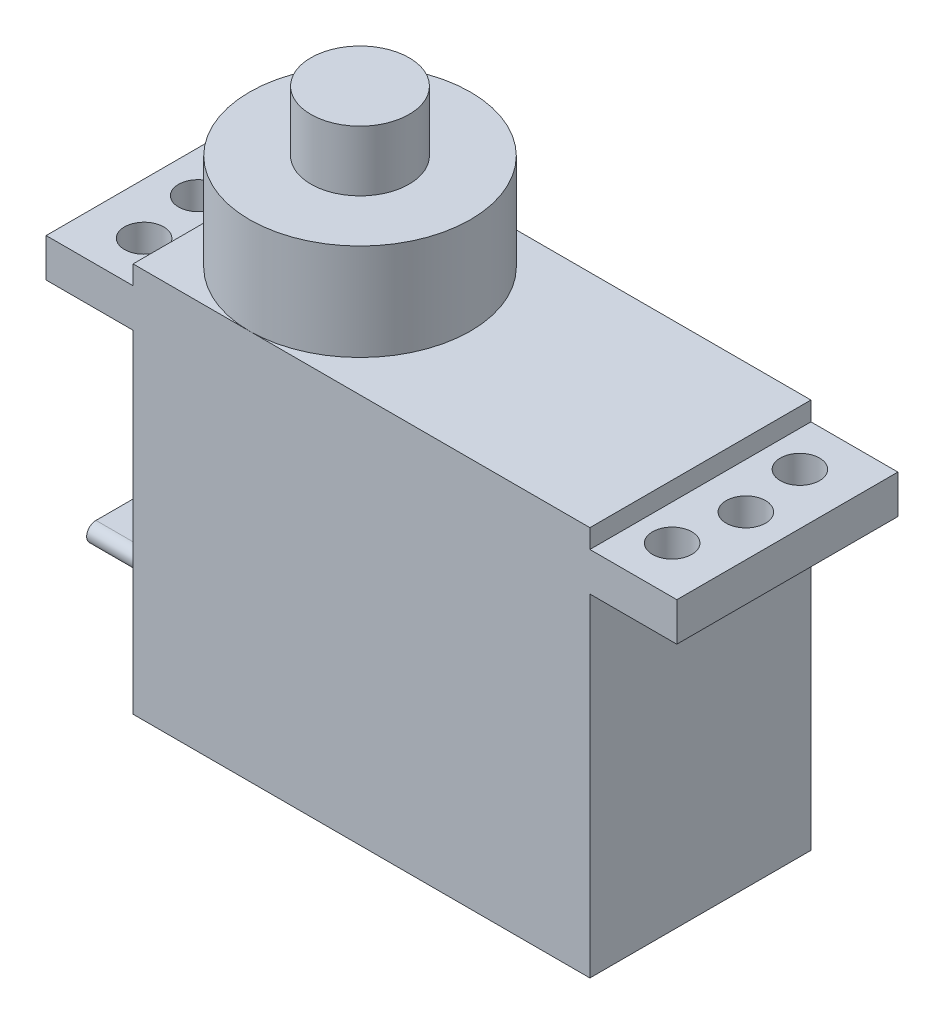
ISO-10303-21;
HEADER;
FILE_DESCRIPTION(('STEP AP214'),'2;1');
FILE_NAME('part.step','',(''),(''),'','','');
FILE_SCHEMA(('AUTOMOTIVE_DESIGN { 1 0 10303 214 1 1 1 1 }'));
ENDSEC;
DATA;
#1=APPLICATION_CONTEXT('core data for automotive mechanical design processes');
#2=APPLICATION_PROTOCOL_DEFINITION('international standard','automotive_design',2000,#1);
#3=PRODUCT_CONTEXT('',#1,'mechanical');
#4=PRODUCT('Part','Part','',(#3));
#5=PRODUCT_RELATED_PRODUCT_CATEGORY('part','',(#4));
#6=PRODUCT_DEFINITION_FORMATION('','',#4);
#7=PRODUCT_DEFINITION_CONTEXT('part definition',#1,'design');
#8=PRODUCT_DEFINITION('design','',#6,#7);
#9=PRODUCT_DEFINITION_SHAPE('','',#8);
#10=(LENGTH_UNIT() NAMED_UNIT(*) SI_UNIT(.MILLI.,.METRE.));
#11=(NAMED_UNIT(*) PLANE_ANGLE_UNIT() SI_UNIT($,.RADIAN.));
#12=(NAMED_UNIT(*) SI_UNIT($,.STERADIAN.) SOLID_ANGLE_UNIT());
#13=UNCERTAINTY_MEASURE_WITH_UNIT(LENGTH_MEASURE(1.E-05),#10,'distance_accuracy_value','');
#14=(GEOMETRIC_REPRESENTATION_CONTEXT(3) GLOBAL_UNCERTAINTY_ASSIGNED_CONTEXT((#13)) GLOBAL_UNIT_ASSIGNED_CONTEXT((#10,
#11,#12)) REPRESENTATION_CONTEXT('',''));
#15=CARTESIAN_POINT('',(0.,0.,0.));
#16=DIRECTION('',(0.,0.,1.));
#17=DIRECTION('',(1.,0.,0.));
#18=AXIS2_PLACEMENT_3D('',#15,#16,#17);
#19=CARTESIAN_POINT('',(-13.2207,0.,0.));
#20=DIRECTION('',(1.,0.,0.));
#21=DIRECTION('',(0.,0.,-1.));
#22=AXIS2_PLACEMENT_3D('',#19,#20,#21);
#23=PLANE('',#22);
#24=DIRECTION('',(0.,-1.,0.));
#25=VECTOR('',#24,1.);
#26=CARTESIAN_POINT('',(-13.2207,1.524,-3.0226));
#27=LINE('',#26,#25);
#28=CARTESIAN_POINT('',(-13.2207,4.826,-3.0226));
#29=VERTEX_POINT('',#28);
#30=CARTESIAN_POINT('',(-13.2207,1.524,-3.0226));
#31=VERTEX_POINT('',#30);
#32=EDGE_CURVE('E210',#29,#31,#27,.T.);
#33=ORIENTED_EDGE('',*,*,#32,.T.);
#34=DIRECTION('',(0.,0.,1.));
#35=VECTOR('',#34,1.);
#36=CARTESIAN_POINT('',(-13.2207,1.524,-3.0226));
#37=LINE('',#36,#35);
#38=CARTESIAN_POINT('',(-13.2207,1.524,3.0226));
#39=VERTEX_POINT('',#38);
#40=EDGE_CURVE('E213',#31,#39,#37,.T.);
#41=ORIENTED_EDGE('',*,*,#40,.T.);
#42=DIRECTION('',(0.,1.,0.));
#43=VECTOR('',#42,1.);
#44=CARTESIAN_POINT('',(-13.2207,1.524,3.0226));
#45=LINE('',#44,#43);
#46=CARTESIAN_POINT('',(-13.2207,4.826,3.0226));
#47=VERTEX_POINT('',#46);
#48=EDGE_CURVE('E216',#39,#47,#45,.T.);
#49=ORIENTED_EDGE('',*,*,#48,.T.);
#50=DIRECTION('',(0.,0.,-1.));
#51=VECTOR('',#50,1.);
#52=CARTESIAN_POINT('',(-13.2207,4.826,-3.0226));
#53=LINE('',#52,#51);
#54=EDGE_CURVE('E218',#47,#29,#53,.T.);
#55=ORIENTED_EDGE('',*,*,#54,.T.);
#56=EDGE_LOOP('',(#33,#41,#49,#55));
#57=FACE_BOUND('',#56,.T.);
#58=CARTESIAN_POINT('',(-13.2207,3.175,1.651));
#59=DIRECTION('',(-1.,0.,0.));
#60=DIRECTION('',(0.,0.,1.));
#61=AXIS2_PLACEMENT_3D('',#58,#59,#60);
#62=CIRCLE('',#61,0.4826);
#63=CARTESIAN_POINT('',(-13.2207,2.6924,1.651));
#64=VERTEX_POINT('',#63);
#65=CARTESIAN_POINT('',(-13.2207,3.6576,1.651));
#66=VERTEX_POINT('',#65);
#67=EDGE_CURVE('E53',#64,#66,#62,.T.);
#68=ORIENTED_EDGE('',*,*,#67,.F.);
#69=DIRECTION('',(0.,0.,1.));
#70=VECTOR('',#69,1.);
#71=CARTESIAN_POINT('',(-13.2207,2.6924,1.651));
#72=LINE('',#71,#70);
#73=CARTESIAN_POINT('',(-13.2207,2.6924,-1.651));
#74=VERTEX_POINT('',#73);
#75=EDGE_CURVE('E57',#74,#64,#72,.T.);
#76=ORIENTED_EDGE('',*,*,#75,.F.);
#77=CARTESIAN_POINT('',(-13.2207,3.175,-1.651));
#78=DIRECTION('',(-1.,0.,0.));
#79=DIRECTION('',(0.,0.,1.));
#80=AXIS2_PLACEMENT_3D('',#77,#78,#79);
#81=CIRCLE('',#80,0.4826);
#82=CARTESIAN_POINT('',(-13.2207,3.6576,-1.651));
#83=VERTEX_POINT('',#82);
#84=EDGE_CURVE('E727',#83,#74,#81,.T.);
#85=ORIENTED_EDGE('',*,*,#84,.F.);
#86=DIRECTION('',(0.,0.,-1.));
#87=VECTOR('',#86,1.);
#88=CARTESIAN_POINT('',(-13.2207,3.6576,1.651));
#89=LINE('',#88,#87);
#90=EDGE_CURVE('E733',#66,#83,#89,.T.);
#91=ORIENTED_EDGE('',*,*,#90,.F.);
#92=EDGE_LOOP('',(#68,#76,#85,#91));
#93=FACE_BOUND('',#92,.T.);
#94=ADVANCED_FACE('F36',(#57,#93),#23,.F.);
#95=CARTESIAN_POINT('',(-11.811,20.1676,5.715));
#96=DIRECTION('',(1.,0.,0.));
#97=DIRECTION('',(0.,1.,0.));
#98=AXIS2_PLACEMENT_3D('',#95,#96,#97);
#99=PLANE('',#98);
#100=DIRECTION('',(0.,0.,1.));
#101=VECTOR('',#100,1.);
#102=CARTESIAN_POINT('',(-11.811,17.1958,-5.715));
#103=LINE('',#102,#101);
#104=CARTESIAN_POINT('',(-11.811,17.1958,-5.715));
#105=VERTEX_POINT('',#104);
#106=CARTESIAN_POINT('',(-11.811,17.1958,5.715));
#107=VERTEX_POINT('',#106);
#108=EDGE_CURVE('E303',#105,#107,#103,.T.);
#109=ORIENTED_EDGE('',*,*,#108,.F.);
#110=DIRECTION('',(0.,-1.,0.));
#111=VECTOR('',#110,1.);
#112=CARTESIAN_POINT('',(-11.811,20.1676,-5.715));
#113=LINE('',#112,#111);
#114=CARTESIAN_POINT('',(-11.811,0.,-5.715));
#115=VERTEX_POINT('',#114);
#116=EDGE_CURVE('E353',#105,#115,#113,.T.);
#117=ORIENTED_EDGE('',*,*,#116,.T.);
#118=DIRECTION('',(0.,0.,-1.));
#119=VECTOR('',#118,1.);
#120=CARTESIAN_POINT('',(-11.811,0.,5.715));
#121=LINE('',#120,#119);
#122=CARTESIAN_POINT('',(-11.811,0.,5.715));
#123=VERTEX_POINT('',#122);
#124=EDGE_CURVE('E360',#123,#115,#121,.T.);
#125=ORIENTED_EDGE('',*,*,#124,.F.);
#126=DIRECTION('',(0.,-1.,0.));
#127=VECTOR('',#126,1.);
#128=CARTESIAN_POINT('',(-11.811,20.1676,5.715));
#129=LINE('',#128,#127);
#130=EDGE_CURVE('E339',#107,#123,#129,.T.);
#131=ORIENTED_EDGE('',*,*,#130,.F.);
#132=EDGE_LOOP('',(#109,#117,#125,#131));
#133=FACE_BOUND('',#132,.T.);
#134=DIRECTION('',(0.,-1.,0.));
#135=VECTOR('',#134,1.);
#136=CARTESIAN_POINT('',(-11.811,1.524,-3.0226));
#137=LINE('',#136,#135);
#138=CARTESIAN_POINT('',(-11.811,4.826,-3.0226));
#139=VERTEX_POINT('',#138);
#140=CARTESIAN_POINT('',(-11.811,1.524,-3.0226));
#141=VERTEX_POINT('',#140);
#142=EDGE_CURVE('E201',#139,#141,#137,.T.);
#143=ORIENTED_EDGE('',*,*,#142,.F.);
#144=DIRECTION('',(0.,0.,-1.));
#145=VECTOR('',#144,1.);
#146=CARTESIAN_POINT('',(-11.811,4.826,-3.0226));
#147=LINE('',#146,#145);
#148=CARTESIAN_POINT('',(-11.811,4.826,3.0226));
#149=VERTEX_POINT('',#148);
#150=EDGE_CURVE('E214',#149,#139,#147,.T.);
#151=ORIENTED_EDGE('',*,*,#150,.F.);
#152=DIRECTION('',(0.,1.,0.));
#153=VECTOR('',#152,1.);
#154=CARTESIAN_POINT('',(-11.811,1.524,3.0226));
#155=LINE('',#154,#153);
#156=CARTESIAN_POINT('',(-11.811,1.524,3.0226));
#157=VERTEX_POINT('',#156);
#158=EDGE_CURVE('E223',#157,#149,#155,.T.);
#159=ORIENTED_EDGE('',*,*,#158,.F.);
#160=DIRECTION('',(0.,0.,1.));
#161=VECTOR('',#160,1.);
#162=CARTESIAN_POINT('',(-11.811,1.524,-3.0226));
#163=LINE('',#162,#161);
#164=EDGE_CURVE('E204',#141,#157,#163,.T.);
#165=ORIENTED_EDGE('',*,*,#164,.F.);
#166=EDGE_LOOP('',(#143,#151,#159,#165));
#167=FACE_BOUND('',#166,.T.);
#168=ADVANCED_FACE('F431',(#133,#167),#99,.F.);
#169=CARTESIAN_POINT('',(-11.811,20.1676,5.715));
#170=DIRECTION('',(0.,-1.,0.));
#171=DIRECTION('',(1.,0.,0.));
#172=AXIS2_PLACEMENT_3D('',#169,#170,#171);
#173=PLANE('',#172);
#174=DIRECTION('',(-1.,0.,0.));
#175=VECTOR('',#174,1.);
#176=CARTESIAN_POINT('',(-11.811,20.1676,5.715));
#177=LINE('',#176,#175);
#178=CARTESIAN_POINT('',(-5.7912,20.1676,5.715));
#179=VERTEX_POINT('',#178);
#180=CARTESIAN_POINT('',(-11.811,20.1676,5.715));
#181=VERTEX_POINT('',#180);
#182=EDGE_CURVE('E334',#179,#181,#177,.T.);
#183=ORIENTED_EDGE('',*,*,#182,.F.);
#184=CARTESIAN_POINT('',(-5.7912,20.1676,0.));
#185=DIRECTION('',(0.,-1.,0.));
#186=DIRECTION('',(1.,0.,0.));
#187=AXIS2_PLACEMENT_3D('',#184,#185,#186);
#188=CIRCLE('',#187,5.715);
#189=CARTESIAN_POINT('',(-5.7912,20.1676,-5.715));
#190=VERTEX_POINT('',#189);
#191=EDGE_CURVE('E276',#179,#190,#188,.T.);
#192=ORIENTED_EDGE('',*,*,#191,.T.);
#193=DIRECTION('',(-1.,0.,0.));
#194=VECTOR('',#193,1.);
#195=CARTESIAN_POINT('',(-11.811,20.1676,-5.715));
#196=LINE('',#195,#194);
#197=CARTESIAN_POINT('',(-11.811,20.1676,-5.715));
#198=VERTEX_POINT('',#197);
#199=EDGE_CURVE('E349',#190,#198,#196,.T.);
#200=ORIENTED_EDGE('',*,*,#199,.T.);
#201=DIRECTION('',(0.,0.,-1.));
#202=VECTOR('',#201,1.);
#203=CARTESIAN_POINT('',(-11.811,20.1676,5.715));
#204=LINE('',#203,#202);
#205=EDGE_CURVE('E363',#181,#198,#204,.T.);
#206=ORIENTED_EDGE('',*,*,#205,.F.);
#207=EDGE_LOOP('',(#183,#192,#200,#206));
#208=FACE_BOUND('',#207,.T.);
#209=ADVANCED_FACE('F412',(#208),#173,.F.);
#210=CARTESIAN_POINT('',(11.811,20.1676,5.715));
#211=DIRECTION('',(-1.,0.,0.));
#212=DIRECTION('',(0.,-1.,0.));
#213=AXIS2_PLACEMENT_3D('',#210,#211,#212);
#214=PLANE('',#213);
#215=DIRECTION('',(0.,1.,0.));
#216=VECTOR('',#215,1.);
#217=CARTESIAN_POINT('',(11.811,20.1676,-5.715));
#218=LINE('',#217,#216);
#219=CARTESIAN_POINT('',(11.811,0.,-5.715));
#220=VERTEX_POINT('',#219);
#221=CARTESIAN_POINT('',(11.811,17.1958,-5.715));
#222=VERTEX_POINT('',#221);
#223=EDGE_CURVE('E346',#220,#222,#218,.T.);
#224=ORIENTED_EDGE('',*,*,#223,.T.);
#225=DIRECTION('',(0.,0.,1.));
#226=VECTOR('',#225,1.);
#227=CARTESIAN_POINT('',(11.811,17.1958,-5.715));
#228=LINE('',#227,#226);
#229=CARTESIAN_POINT('',(11.811,17.1958,5.715));
#230=VERTEX_POINT('',#229);
#231=EDGE_CURVE('E281',#222,#230,#228,.T.);
#232=ORIENTED_EDGE('',*,*,#231,.T.);
#233=DIRECTION('',(0.,1.,0.));
#234=VECTOR('',#233,1.);
#235=CARTESIAN_POINT('',(11.811,20.1676,5.715));
#236=LINE('',#235,#234);
#237=CARTESIAN_POINT('',(11.811,0.,5.715));
#238=VERTEX_POINT('',#237);
#239=EDGE_CURVE('E331',#238,#230,#236,.T.);
#240=ORIENTED_EDGE('',*,*,#239,.F.);
#241=DIRECTION('',(0.,0.,-1.));
#242=VECTOR('',#241,1.);
#243=CARTESIAN_POINT('',(11.811,0.,5.715));
#244=LINE('',#243,#242);
#245=EDGE_CURVE('E345',#238,#220,#244,.T.);
#246=ORIENTED_EDGE('',*,*,#245,.T.);
#247=EDGE_LOOP('',(#224,#232,#240,#246));
#248=FACE_BOUND('',#247,.T.);
#249=ADVANCED_FACE('F443',(#248),#214,.F.);
#250=DIRECTION('',(0.,0.,-1.));
#251=VECTOR('',#250,1.);
#252=CARTESIAN_POINT('',(-11.811,19.1897,-5.715));
#253=LINE('',#252,#251);
#254=CARTESIAN_POINT('',(-11.811,19.1897,5.715));
#255=VERTEX_POINT('',#254);
#256=CARTESIAN_POINT('',(-11.811,19.1897,-5.715));
#257=VERTEX_POINT('',#256);
#258=EDGE_CURVE('E308',#255,#257,#253,.T.);
#259=ORIENTED_EDGE('',*,*,#258,.F.);
#260=EDGE_CURVE('E340',#181,#255,#129,.T.);
#261=ORIENTED_EDGE('',*,*,#260,.F.);
#262=ORIENTED_EDGE('',*,*,#205,.T.);
#263=EDGE_CURVE('E354',#198,#257,#113,.T.);
#264=ORIENTED_EDGE('',*,*,#263,.T.);
#265=EDGE_LOOP('',(#259,#261,#262,#264));
#266=FACE_BOUND('',#265,.T.);
#267=ADVANCED_FACE('F452',(#266),#99,.F.);
#268=CARTESIAN_POINT('',(11.811,19.1897,5.715));
#269=VERTEX_POINT('',#268);
#270=CARTESIAN_POINT('',(11.811,20.1676,5.715));
#271=VERTEX_POINT('',#270);
#272=EDGE_CURVE('E335',#269,#271,#236,.T.);
#273=ORIENTED_EDGE('',*,*,#272,.F.);
#274=DIRECTION('',(0.,0.,-1.));
#275=VECTOR('',#274,1.);
#276=CARTESIAN_POINT('',(11.811,19.1897,-5.715));
#277=LINE('',#276,#275);
#278=CARTESIAN_POINT('',(11.811,19.1897,-5.715));
#279=VERTEX_POINT('',#278);
#280=EDGE_CURVE('E291',#269,#279,#277,.T.);
#281=ORIENTED_EDGE('',*,*,#280,.T.);
#282=CARTESIAN_POINT('',(11.811,20.1676,-5.715));
#283=VERTEX_POINT('',#282);
#284=EDGE_CURVE('E330',#279,#283,#218,.T.);
#285=ORIENTED_EDGE('',*,*,#284,.T.);
#286=DIRECTION('',(0.,0.,-1.));
#287=VECTOR('',#286,1.);
#288=CARTESIAN_POINT('',(11.811,20.1676,5.715));
#289=LINE('',#288,#287);
#290=EDGE_CURVE('E45',#271,#283,#289,.T.);
#291=ORIENTED_EDGE('',*,*,#290,.F.);
#292=EDGE_LOOP('',(#273,#281,#285,#291));
#293=FACE_BOUND('',#292,.T.);
#294=ADVANCED_FACE('F38',(#293),#214,.F.);
#295=EDGE_CURVE('E350',#283,#190,#196,.T.);
#296=ORIENTED_EDGE('',*,*,#295,.T.);
#297=EDGE_CURVE('E273',#190,#179,#188,.T.);
#298=ORIENTED_EDGE('',*,*,#297,.T.);
#299=EDGE_CURVE('E336',#271,#179,#177,.T.);
#300=ORIENTED_EDGE('',*,*,#299,.F.);
#301=ORIENTED_EDGE('',*,*,#290,.T.);
#302=EDGE_LOOP('',(#296,#298,#300,#301));
#303=FACE_BOUND('',#302,.T.);
#304=ADVANCED_FACE('F405',(#303),#173,.F.);
#305=CARTESIAN_POINT('',(-11.811,0.,5.715));
#306=DIRECTION('',(0.,1.,0.));
#307=DIRECTION('',(-1.,0.,0.));
#308=AXIS2_PLACEMENT_3D('',#305,#306,#307);
#309=PLANE('',#308);
#310=DIRECTION('',(1.,0.,0.));
#311=VECTOR('',#310,1.);
#312=CARTESIAN_POINT('',(-11.811,0.,-5.715));
#313=LINE('',#312,#311);
#314=EDGE_CURVE('E356',#115,#220,#313,.T.);
#315=ORIENTED_EDGE('',*,*,#314,.T.);
#316=ORIENTED_EDGE('',*,*,#245,.F.);
#317=DIRECTION('',(1.,0.,0.));
#318=VECTOR('',#317,1.);
#319=CARTESIAN_POINT('',(-11.811,0.,5.715));
#320=LINE('',#319,#318);
#321=EDGE_CURVE('E343',#123,#238,#320,.T.);
#322=ORIENTED_EDGE('',*,*,#321,.F.);
#323=ORIENTED_EDGE('',*,*,#124,.T.);
#324=EDGE_LOOP('',(#315,#316,#322,#323));
#325=FACE_BOUND('',#324,.T.);
#326=ADVANCED_FACE('F439',(#325),#309,.F.);
#327=CARTESIAN_POINT('',(0.,0.,5.715));
#328=DIRECTION('',(0.,0.,1.));
#329=DIRECTION('',(1.,0.,0.));
#330=AXIS2_PLACEMENT_3D('',#327,#328,#329);
#331=PLANE('',#330);
#332=ORIENTED_EDGE('',*,*,#239,.T.);
#333=DIRECTION('',(-1.,0.,0.));
#334=VECTOR('',#333,1.);
#335=CARTESIAN_POINT('',(16.3068,17.1958,5.715));
#336=LINE('',#335,#334);
#337=CARTESIAN_POINT('',(16.3068,17.1958,5.715));
#338=VERTEX_POINT('',#337);
#339=EDGE_CURVE('E297',#338,#230,#336,.T.);
#340=ORIENTED_EDGE('',*,*,#339,.F.);
#341=DIRECTION('',(0.,1.,0.));
#342=VECTOR('',#341,1.);
#343=CARTESIAN_POINT('',(16.3068,19.1897,5.715));
#344=LINE('',#343,#342);
#345=CARTESIAN_POINT('',(16.3068,19.1897,5.715));
#346=VERTEX_POINT('',#345);
#347=EDGE_CURVE('E284',#338,#346,#344,.T.);
#348=ORIENTED_EDGE('',*,*,#347,.T.);
#349=DIRECTION('',(-1.,0.,0.));
#350=VECTOR('',#349,1.);
#351=CARTESIAN_POINT('',(16.3068,19.1897,5.715));
#352=LINE('',#351,#350);
#353=EDGE_CURVE('E299',#346,#269,#352,.T.);
#354=ORIENTED_EDGE('',*,*,#353,.T.);
#355=ORIENTED_EDGE('',*,*,#272,.T.);
#356=ORIENTED_EDGE('',*,*,#299,.T.);
#357=ORIENTED_EDGE('',*,*,#182,.T.);
#358=ORIENTED_EDGE('',*,*,#260,.T.);
#359=DIRECTION('',(1.,0.,0.));
#360=VECTOR('',#359,1.);
#361=CARTESIAN_POINT('',(-16.3068,19.1897,5.715));
#362=LINE('',#361,#360);
#363=CARTESIAN_POINT('',(-16.3068,19.1897,5.715));
#364=VERTEX_POINT('',#363);
#365=EDGE_CURVE('E321',#364,#255,#362,.T.);
#366=ORIENTED_EDGE('',*,*,#365,.F.);
#367=DIRECTION('',(0.,1.,0.));
#368=VECTOR('',#367,1.);
#369=CARTESIAN_POINT('',(-16.3068,19.1897,5.715));
#370=LINE('',#369,#368);
#371=CARTESIAN_POINT('',(-16.3068,17.1958,5.715));
#372=VERTEX_POINT('',#371);
#373=EDGE_CURVE('E310',#372,#364,#370,.T.);
#374=ORIENTED_EDGE('',*,*,#373,.F.);
#375=DIRECTION('',(1.,0.,0.));
#376=VECTOR('',#375,1.);
#377=CARTESIAN_POINT('',(-16.3068,17.1958,5.715));
#378=LINE('',#377,#376);
#379=EDGE_CURVE('E324',#372,#107,#378,.T.);
#380=ORIENTED_EDGE('',*,*,#379,.T.);
#381=ORIENTED_EDGE('',*,*,#130,.T.);
#382=ORIENTED_EDGE('',*,*,#321,.T.);
#383=EDGE_LOOP('',(#332,#340,#348,#354,#355,#356,#357,#358,#366,#374,#380,#381,#382));
#384=FACE_BOUND('',#383,.T.);
#385=ADVANCED_FACE('F403',(#384),#331,.T.);
#386=CARTESIAN_POINT('',(0.,0.,-5.715));
#387=DIRECTION('',(0.,0.,1.));
#388=DIRECTION('',(1.,0.,0.));
#389=AXIS2_PLACEMENT_3D('',#386,#387,#388);
#390=PLANE('',#389);
#391=ORIENTED_EDGE('',*,*,#223,.F.);
#392=ORIENTED_EDGE('',*,*,#314,.F.);
#393=ORIENTED_EDGE('',*,*,#116,.F.);
#394=DIRECTION('',(1.,0.,0.));
#395=VECTOR('',#394,1.);
#396=CARTESIAN_POINT('',(-16.3068,17.1958,-5.715));
#397=LINE('',#396,#395);
#398=CARTESIAN_POINT('',(-16.3068,17.1958,-5.715));
#399=VERTEX_POINT('',#398);
#400=EDGE_CURVE('E327',#399,#105,#397,.T.);
#401=ORIENTED_EDGE('',*,*,#400,.F.);
#402=DIRECTION('',(0.,-1.,0.));
#403=VECTOR('',#402,1.);
#404=CARTESIAN_POINT('',(-16.3068,19.1897,-5.715));
#405=LINE('',#404,#403);
#406=CARTESIAN_POINT('',(-16.3068,19.1897,-5.715));
#407=VERTEX_POINT('',#406);
#408=EDGE_CURVE('E304',#407,#399,#405,.T.);
#409=ORIENTED_EDGE('',*,*,#408,.F.);
#410=DIRECTION('',(1.,0.,0.));
#411=VECTOR('',#410,1.);
#412=CARTESIAN_POINT('',(-16.3068,19.1897,-5.715));
#413=LINE('',#412,#411);
#414=EDGE_CURVE('E314',#407,#257,#413,.T.);
#415=ORIENTED_EDGE('',*,*,#414,.T.);
#416=ORIENTED_EDGE('',*,*,#263,.F.);
#417=ORIENTED_EDGE('',*,*,#199,.F.);
#418=ORIENTED_EDGE('',*,*,#295,.F.);
#419=ORIENTED_EDGE('',*,*,#284,.F.);
#420=DIRECTION('',(-1.,0.,0.));
#421=VECTOR('',#420,1.);
#422=CARTESIAN_POINT('',(16.3068,19.1897,-5.715));
#423=LINE('',#422,#421);
#424=CARTESIAN_POINT('',(16.3068,19.1897,-5.715));
#425=VERTEX_POINT('',#424);
#426=EDGE_CURVE('E301',#425,#279,#423,.T.);
#427=ORIENTED_EDGE('',*,*,#426,.F.);
#428=DIRECTION('',(0.,-1.,0.));
#429=VECTOR('',#428,1.);
#430=CARTESIAN_POINT('',(16.3068,19.1897,-5.715));
#431=LINE('',#430,#429);
#432=CARTESIAN_POINT('',(16.3068,17.1958,-5.715));
#433=VERTEX_POINT('',#432);
#434=EDGE_CURVE('E277',#425,#433,#431,.T.);
#435=ORIENTED_EDGE('',*,*,#434,.T.);
#436=DIRECTION('',(-1.,0.,0.));
#437=VECTOR('',#436,1.);
#438=CARTESIAN_POINT('',(16.3068,17.1958,-5.715));
#439=LINE('',#438,#437);
#440=EDGE_CURVE('E290',#433,#222,#439,.T.);
#441=ORIENTED_EDGE('',*,*,#440,.T.);
#442=EDGE_LOOP('',(#391,#392,#393,#401,#409,#415,#416,#417,#418,#419,#427,#435,#441));
#443=FACE_BOUND('',#442,.T.);
#444=ADVANCED_FACE('F436',(#443),#390,.F.);
#445=CARTESIAN_POINT('',(-16.3068,17.1958,-5.715));
#446=DIRECTION('',(0.,1.,0.));
#447=DIRECTION('',(-1.,0.,0.));
#448=AXIS2_PLACEMENT_3D('',#445,#446,#447);
#449=PLANE('',#448);
#450=CARTESIAN_POINT('',(-13.6525,17.1958,-3.302));
#451=DIRECTION('',(0.,1.,0.));
#452=DIRECTION('',(-1.,0.,0.));
#453=AXIS2_PLACEMENT_3D('',#450,#451,#452);
#454=CIRCLE('',#453,1.016);
#455=CARTESIAN_POINT('',(-14.6685,17.1958,-3.302));
#456=VERTEX_POINT('',#455);
#457=EDGE_CURVE('E264',#456,#456,#454,.T.);
#458=ORIENTED_EDGE('',*,*,#457,.T.);
#459=EDGE_LOOP('',(#458));
#460=FACE_BOUND('',#459,.T.);
#461=CARTESIAN_POINT('',(-13.6525,17.1958,3.302));
#462=DIRECTION('',(0.,1.,0.));
#463=DIRECTION('',(-1.,0.,0.));
#464=AXIS2_PLACEMENT_3D('',#461,#462,#463);
#465=CIRCLE('',#464,1.016);
#466=CARTESIAN_POINT('',(-14.6685,17.1958,3.302));
#467=VERTEX_POINT('',#466);
#468=EDGE_CURVE('E261',#467,#467,#465,.T.);
#469=ORIENTED_EDGE('',*,*,#468,.T.);
#470=EDGE_LOOP('',(#469));
#471=FACE_BOUND('',#470,.T.);
#472=CARTESIAN_POINT('',(-14.1605,17.1958,0.));
#473=DIRECTION('',(0.,1.,0.));
#474=DIRECTION('',(-1.,0.,0.));
#475=AXIS2_PLACEMENT_3D('',#472,#473,#474);
#476=CIRCLE('',#475,1.016);
#477=CARTESIAN_POINT('',(-15.1765,17.1958,0.));
#478=VERTEX_POINT('',#477);
#479=EDGE_CURVE('E252',#478,#478,#476,.T.);
#480=ORIENTED_EDGE('',*,*,#479,.T.);
#481=EDGE_LOOP('',(#480));
#482=FACE_BOUND('',#481,.T.);
#483=ORIENTED_EDGE('',*,*,#108,.T.);
#484=ORIENTED_EDGE('',*,*,#379,.F.);
#485=DIRECTION('',(0.,0.,1.));
#486=VECTOR('',#485,1.);
#487=CARTESIAN_POINT('',(-16.3068,17.1958,-5.715));
#488=LINE('',#487,#486);
#489=EDGE_CURVE('E307',#399,#372,#488,.T.);
#490=ORIENTED_EDGE('',*,*,#489,.F.);
#491=ORIENTED_EDGE('',*,*,#400,.T.);
#492=EDGE_LOOP('',(#483,#484,#490,#491));
#493=FACE_BOUND('',#492,.T.);
#494=ADVANCED_FACE('F428',(#460,#471,#482,#493),#449,.F.);
#495=CARTESIAN_POINT('',(-16.3068,19.1897,-5.715));
#496=DIRECTION('',(0.,-1.,0.));
#497=DIRECTION('',(1.,0.,0.));
#498=AXIS2_PLACEMENT_3D('',#495,#496,#497);
#499=PLANE('',#498);
#500=CARTESIAN_POINT('',(-13.6525,19.1897,-3.302));
#501=DIRECTION('',(0.,1.,0.));
#502=DIRECTION('',(-1.,0.,0.));
#503=AXIS2_PLACEMENT_3D('',#500,#501,#502);
#504=CIRCLE('',#503,1.016);
#505=CARTESIAN_POINT('',(-14.6685,19.1897,-3.302));
#506=VERTEX_POINT('',#505);
#507=EDGE_CURVE('E249',#506,#506,#504,.T.);
#508=ORIENTED_EDGE('',*,*,#507,.F.);
#509=EDGE_LOOP('',(#508));
#510=FACE_BOUND('',#509,.T.);
#511=CARTESIAN_POINT('',(-13.6525,19.1897,3.302));
#512=DIRECTION('',(0.,1.,0.));
#513=DIRECTION('',(-1.,0.,0.));
#514=AXIS2_PLACEMENT_3D('',#511,#512,#513);
#515=CIRCLE('',#514,1.016);
#516=CARTESIAN_POINT('',(-14.6685,19.1897,3.302));
#517=VERTEX_POINT('',#516);
#518=EDGE_CURVE('E253',#517,#517,#515,.T.);
#519=ORIENTED_EDGE('',*,*,#518,.F.);
#520=EDGE_LOOP('',(#519));
#521=FACE_BOUND('',#520,.T.);
#522=CARTESIAN_POINT('',(-14.1605,19.1897,0.));
#523=DIRECTION('',(0.,1.,0.));
#524=DIRECTION('',(-1.,0.,0.));
#525=AXIS2_PLACEMENT_3D('',#522,#523,#524);
#526=CIRCLE('',#525,1.016);
#527=CARTESIAN_POINT('',(-15.1765,19.1897,0.));
#528=VERTEX_POINT('',#527);
#529=EDGE_CURVE('E256',#528,#528,#526,.T.);
#530=ORIENTED_EDGE('',*,*,#529,.F.);
#531=EDGE_LOOP('',(#530));
#532=FACE_BOUND('',#531,.T.);
#533=ORIENTED_EDGE('',*,*,#258,.T.);
#534=ORIENTED_EDGE('',*,*,#414,.F.);
#535=DIRECTION('',(0.,0.,-1.));
#536=VECTOR('',#535,1.);
#537=CARTESIAN_POINT('',(-16.3068,19.1897,-5.715));
#538=LINE('',#537,#536);
#539=EDGE_CURVE('E312',#364,#407,#538,.T.);
#540=ORIENTED_EDGE('',*,*,#539,.F.);
#541=ORIENTED_EDGE('',*,*,#365,.T.);
#542=EDGE_LOOP('',(#533,#534,#540,#541));
#543=FACE_BOUND('',#542,.T.);
#544=ADVANCED_FACE('F420',(#510,#521,#532,#543),#499,.F.);
#545=CARTESIAN_POINT('',(-16.3068,0.,0.));
#546=DIRECTION('',(-1.,0.,0.));
#547=DIRECTION('',(0.,0.,1.));
#548=AXIS2_PLACEMENT_3D('',#545,#546,#547);
#549=PLANE('',#548);
#550=ORIENTED_EDGE('',*,*,#408,.T.);
#551=ORIENTED_EDGE('',*,*,#489,.T.);
#552=ORIENTED_EDGE('',*,*,#373,.T.);
#553=ORIENTED_EDGE('',*,*,#539,.T.);
#554=EDGE_LOOP('',(#550,#551,#552,#553));
#555=FACE_BOUND('',#554,.T.);
#556=ADVANCED_FACE('F389',(#555),#549,.T.);
#557=CARTESIAN_POINT('',(16.3068,19.1897,-5.715));
#558=DIRECTION('',(0.,1.,0.));
#559=DIRECTION('',(-1.,0.,0.));
#560=AXIS2_PLACEMENT_3D('',#557,#558,#559);
#561=PLANE('',#560);
#562=CARTESIAN_POINT('',(13.6525,19.1897,-3.302));
#563=DIRECTION('',(0.,-1.,0.));
#564=DIRECTION('',(1.,0.,0.));
#565=AXIS2_PLACEMENT_3D('',#562,#563,#564);
#566=CIRCLE('',#565,1.016);
#567=CARTESIAN_POINT('',(14.6685,19.1897,-3.302));
#568=VERTEX_POINT('',#567);
#569=EDGE_CURVE('E240',#568,#568,#566,.T.);
#570=ORIENTED_EDGE('',*,*,#569,.T.);
#571=EDGE_LOOP('',(#570));
#572=FACE_BOUND('',#571,.T.);
#573=CARTESIAN_POINT('',(13.6525,19.1897,3.302));
#574=DIRECTION('',(0.,-1.,0.));
#575=DIRECTION('',(1.,0.,0.));
#576=AXIS2_PLACEMENT_3D('',#573,#574,#575);
#577=CIRCLE('',#576,1.016);
#578=CARTESIAN_POINT('',(14.6685,19.1897,3.302));
#579=VERTEX_POINT('',#578);
#580=EDGE_CURVE('E244',#579,#579,#577,.T.);
#581=ORIENTED_EDGE('',*,*,#580,.T.);
#582=EDGE_LOOP('',(#581));
#583=FACE_BOUND('',#582,.T.);
#584=CARTESIAN_POINT('',(14.1605,19.1897,0.));
#585=DIRECTION('',(0.,-1.,0.));
#586=DIRECTION('',(1.,0.,0.));
#587=AXIS2_PLACEMENT_3D('',#584,#585,#586);
#588=CIRCLE('',#587,1.016);
#589=CARTESIAN_POINT('',(15.1765,19.1897,0.));
#590=VERTEX_POINT('',#589);
#591=EDGE_CURVE('E239',#590,#590,#588,.T.);
#592=ORIENTED_EDGE('',*,*,#591,.T.);
#593=EDGE_LOOP('',(#592));
#594=FACE_BOUND('',#593,.T.);
#595=ORIENTED_EDGE('',*,*,#280,.F.);
#596=ORIENTED_EDGE('',*,*,#353,.F.);
#597=DIRECTION('',(0.,0.,-1.));
#598=VECTOR('',#597,1.);
#599=CARTESIAN_POINT('',(16.3068,19.1897,-5.715));
#600=LINE('',#599,#598);
#601=EDGE_CURVE('E280',#346,#425,#600,.T.);
#602=ORIENTED_EDGE('',*,*,#601,.T.);
#603=ORIENTED_EDGE('',*,*,#426,.T.);
#604=EDGE_LOOP('',(#595,#596,#602,#603));
#605=FACE_BOUND('',#604,.T.);
#606=ADVANCED_FACE('F386',(#572,#583,#594,#605),#561,.T.);
#607=CARTESIAN_POINT('',(16.3068,17.1958,-5.715));
#608=DIRECTION('',(0.,-1.,0.));
#609=DIRECTION('',(1.,0.,0.));
#610=AXIS2_PLACEMENT_3D('',#607,#608,#609);
#611=PLANE('',#610);
#612=CARTESIAN_POINT('',(13.6525,17.1958,-3.302));
#613=DIRECTION('',(0.,-1.,0.));
#614=DIRECTION('',(1.,0.,0.));
#615=AXIS2_PLACEMENT_3D('',#612,#613,#614);
#616=CIRCLE('',#615,1.016);
#617=CARTESIAN_POINT('',(14.6685,17.1958,-3.302));
#618=VERTEX_POINT('',#617);
#619=EDGE_CURVE('E40',#618,#618,#616,.F.);
#620=ORIENTED_EDGE('',*,*,#619,.T.);
#621=EDGE_LOOP('',(#620));
#622=FACE_BOUND('',#621,.T.);
#623=CARTESIAN_POINT('',(13.6525,17.1958,3.302));
#624=DIRECTION('',(0.,-1.,0.));
#625=DIRECTION('',(1.,0.,0.));
#626=AXIS2_PLACEMENT_3D('',#623,#624,#625);
#627=CIRCLE('',#626,1.016);
#628=CARTESIAN_POINT('',(14.6685,17.1958,3.302));
#629=VERTEX_POINT('',#628);
#630=EDGE_CURVE('E369',#629,#629,#627,.F.);
#631=ORIENTED_EDGE('',*,*,#630,.T.);
#632=EDGE_LOOP('',(#631));
#633=FACE_BOUND('',#632,.T.);
#634=CARTESIAN_POINT('',(14.1605,17.1958,0.));
#635=DIRECTION('',(0.,-1.,0.));
#636=DIRECTION('',(1.,0.,0.));
#637=AXIS2_PLACEMENT_3D('',#634,#635,#636);
#638=CIRCLE('',#637,1.016);
#639=CARTESIAN_POINT('',(15.1765,17.1958,0.));
#640=VERTEX_POINT('',#639);
#641=EDGE_CURVE('E243',#640,#640,#638,.F.);
#642=ORIENTED_EDGE('',*,*,#641,.T.);
#643=EDGE_LOOP('',(#642));
#644=FACE_BOUND('',#643,.T.);
#645=ORIENTED_EDGE('',*,*,#231,.F.);
#646=ORIENTED_EDGE('',*,*,#440,.F.);
#647=DIRECTION('',(0.,0.,1.));
#648=VECTOR('',#647,1.);
#649=CARTESIAN_POINT('',(16.3068,17.1958,-5.715));
#650=LINE('',#649,#648);
#651=EDGE_CURVE('E287',#433,#338,#650,.T.);
#652=ORIENTED_EDGE('',*,*,#651,.T.);
#653=ORIENTED_EDGE('',*,*,#339,.T.);
#654=EDGE_LOOP('',(#645,#646,#652,#653));
#655=FACE_BOUND('',#654,.T.);
#656=ADVANCED_FACE('F376',(#622,#633,#644,#655),#611,.T.);
#657=CARTESIAN_POINT('',(16.3068,0.,0.));
#658=DIRECTION('',(1.,0.,0.));
#659=DIRECTION('',(0.,0.,1.));
#660=AXIS2_PLACEMENT_3D('',#657,#658,#659);
#661=PLANE('',#660);
#662=ORIENTED_EDGE('',*,*,#434,.F.);
#663=ORIENTED_EDGE('',*,*,#601,.F.);
#664=ORIENTED_EDGE('',*,*,#347,.F.);
#665=ORIENTED_EDGE('',*,*,#651,.F.);
#666=EDGE_LOOP('',(#662,#663,#664,#665));
#667=FACE_BOUND('',#666,.T.);
#668=ADVANCED_FACE('F450',(#667),#661,.T.);
#669=CARTESIAN_POINT('',(-5.7912,25.1587,0.));
#670=DIRECTION('',(0.,-1.,0.));
#671=DIRECTION('',(1.,0.,0.));
#672=AXIS2_PLACEMENT_3D('',#669,#670,#671);
#673=CYLINDRICAL_SURFACE('',#672,5.715);
#674=CARTESIAN_POINT('',(-5.7912,25.1587,0.));
#675=DIRECTION('',(0.,-1.,0.));
#676=DIRECTION('',(1.,0.,0.));
#677=AXIS2_PLACEMENT_3D('',#674,#675,#676);
#678=CIRCLE('',#677,5.715);
#679=CARTESIAN_POINT('',(-0.0762000000000028,25.1587,0.));
#680=VERTEX_POINT('',#679);
#681=EDGE_CURVE('E269',#680,#680,#678,.T.);
#682=ORIENTED_EDGE('',*,*,#681,.T.);
#683=EDGE_LOOP('',(#682));
#684=FACE_BOUND('',#683,.T.);
#685=ORIENTED_EDGE('',*,*,#191,.F.);
#686=ORIENTED_EDGE('',*,*,#297,.F.);
#687=EDGE_LOOP('',(#685,#686));
#688=FACE_BOUND('',#687,.T.);
#689=ADVANCED_FACE('F514',(#684,#688),#673,.T.);
#690=CARTESIAN_POINT('',(-5.7912,25.1587,0.));
#691=DIRECTION('',(0.,-1.,0.));
#692=DIRECTION('',(1.,0.,0.));
#693=AXIS2_PLACEMENT_3D('',#690,#691,#692);
#694=PLANE('',#693);
#695=CARTESIAN_POINT('',(-5.7912,25.1587,0.));
#696=DIRECTION('',(0.,1.,0.));
#697=DIRECTION('',(-1.,0.,0.));
#698=AXIS2_PLACEMENT_3D('',#695,#696,#697);
#699=CIRCLE('',#698,2.54);
#700=CARTESIAN_POINT('',(-8.3312,25.1587,0.));
#701=VERTEX_POINT('',#700);
#702=EDGE_CURVE('E11',#701,#701,#699,.T.);
#703=ORIENTED_EDGE('',*,*,#702,.F.);
#704=EDGE_LOOP('',(#703));
#705=FACE_BOUND('',#704,.T.);
#706=ORIENTED_EDGE('',*,*,#681,.F.);
#707=EDGE_LOOP('',(#706));
#708=FACE_BOUND('',#707,.T.);
#709=ADVANCED_FACE('F510',(#705,#708),#694,.F.);
#710=CARTESIAN_POINT('',(-5.79120000000001,28.2829,0.));
#711=DIRECTION('',(0.,-1.,0.));
#712=DIRECTION('',(1.,0.,0.));
#713=AXIS2_PLACEMENT_3D('',#710,#711,#712);
#714=CYLINDRICAL_SURFACE('',#713,2.54);
#715=CARTESIAN_POINT('',(-5.79120000000001,28.2829,0.));
#716=DIRECTION('',(0.,1.,0.));
#717=DIRECTION('',(-1.,0.,0.));
#718=AXIS2_PLACEMENT_3D('',#715,#716,#717);
#719=CIRCLE('',#718,2.54);
#720=CARTESIAN_POINT('',(-8.33120000000001,28.2829,0.));
#721=VERTEX_POINT('',#720);
#722=EDGE_CURVE('E267',#721,#721,#719,.T.);
#723=ORIENTED_EDGE('',*,*,#722,.F.);
#724=EDGE_LOOP('',(#723));
#725=FACE_BOUND('',#724,.T.);
#726=ORIENTED_EDGE('',*,*,#702,.T.);
#727=EDGE_LOOP('',(#726));
#728=FACE_BOUND('',#727,.T.);
#729=ADVANCED_FACE('F506',(#725,#728),#714,.T.);
#730=CARTESIAN_POINT('',(-5.79120000000001,28.2829,0.));
#731=DIRECTION('',(0.,1.,0.));
#732=DIRECTION('',(-1.,0.,0.));
#733=AXIS2_PLACEMENT_3D('',#730,#731,#732);
#734=PLANE('',#733);
#735=ORIENTED_EDGE('',*,*,#722,.T.);
#736=EDGE_LOOP('',(#735));
#737=FACE_BOUND('',#736,.T.);
#738=ADVANCED_FACE('F502',(#737),#734,.T.);
#739=CARTESIAN_POINT('',(-14.1605,0.,0.));
#740=DIRECTION('',(0.,1.,0.));
#741=DIRECTION('',(-1.,0.,0.));
#742=AXIS2_PLACEMENT_3D('',#739,#740,#741);
#743=CYLINDRICAL_SURFACE('',#742,1.016);
#744=ORIENTED_EDGE('',*,*,#529,.T.);
#745=EDGE_LOOP('',(#744));
#746=FACE_BOUND('',#745,.T.);
#747=ORIENTED_EDGE('',*,*,#479,.F.);
#748=EDGE_LOOP('',(#747));
#749=FACE_BOUND('',#748,.T.);
#750=ADVANCED_FACE('F498',(#746,#749),#743,.F.);
#751=CARTESIAN_POINT('',(-13.6525,0.,3.302));
#752=DIRECTION('',(0.,1.,0.));
#753=DIRECTION('',(-1.,0.,0.));
#754=AXIS2_PLACEMENT_3D('',#751,#752,#753);
#755=CYLINDRICAL_SURFACE('',#754,1.016);
#756=ORIENTED_EDGE('',*,*,#518,.T.);
#757=EDGE_LOOP('',(#756));
#758=FACE_BOUND('',#757,.T.);
#759=ORIENTED_EDGE('',*,*,#468,.F.);
#760=EDGE_LOOP('',(#759));
#761=FACE_BOUND('',#760,.T.);
#762=ADVANCED_FACE('F494',(#758,#761),#755,.F.);
#763=CARTESIAN_POINT('',(-13.6525,0.,-3.302));
#764=DIRECTION('',(0.,1.,0.));
#765=DIRECTION('',(-1.,0.,0.));
#766=AXIS2_PLACEMENT_3D('',#763,#764,#765);
#767=CYLINDRICAL_SURFACE('',#766,1.016);
#768=ORIENTED_EDGE('',*,*,#507,.T.);
#769=EDGE_LOOP('',(#768));
#770=FACE_BOUND('',#769,.T.);
#771=ORIENTED_EDGE('',*,*,#457,.F.);
#772=EDGE_LOOP('',(#771));
#773=FACE_BOUND('',#772,.T.);
#774=ADVANCED_FACE('F490',(#770,#773),#767,.F.);
#775=CARTESIAN_POINT('',(14.1605,0.,0.));
#776=DIRECTION('',(0.,1.,0.));
#777=DIRECTION('',(-1.,0.,0.));
#778=AXIS2_PLACEMENT_3D('',#775,#776,#777);
#779=CYLINDRICAL_SURFACE('',#778,1.016);
#780=ORIENTED_EDGE('',*,*,#641,.F.);
#781=EDGE_LOOP('',(#780));
#782=FACE_BOUND('',#781,.T.);
#783=ORIENTED_EDGE('',*,*,#591,.F.);
#784=EDGE_LOOP('',(#783));
#785=FACE_BOUND('',#784,.T.);
#786=ADVANCED_FACE('F486',(#782,#785),#779,.F.);
#787=CARTESIAN_POINT('',(13.6525,0.,3.302));
#788=DIRECTION('',(0.,1.,0.));
#789=DIRECTION('',(-1.,0.,0.));
#790=AXIS2_PLACEMENT_3D('',#787,#788,#789);
#791=CYLINDRICAL_SURFACE('',#790,1.016);
#792=ORIENTED_EDGE('',*,*,#630,.F.);
#793=EDGE_LOOP('',(#792));
#794=FACE_BOUND('',#793,.T.);
#795=ORIENTED_EDGE('',*,*,#580,.F.);
#796=EDGE_LOOP('',(#795));
#797=FACE_BOUND('',#796,.T.);
#798=ADVANCED_FACE('F382',(#794,#797),#791,.F.);
#799=CARTESIAN_POINT('',(13.6525,0.,-3.302));
#800=DIRECTION('',(0.,1.,0.));
#801=DIRECTION('',(-1.,0.,0.));
#802=AXIS2_PLACEMENT_3D('',#799,#800,#801);
#803=CYLINDRICAL_SURFACE('',#802,1.016);
#804=ORIENTED_EDGE('',*,*,#619,.F.);
#805=EDGE_LOOP('',(#804));
#806=FACE_BOUND('',#805,.T.);
#807=ORIENTED_EDGE('',*,*,#569,.F.);
#808=EDGE_LOOP('',(#807));
#809=FACE_BOUND('',#808,.T.);
#810=ADVANCED_FACE('F378',(#806,#809),#803,.F.);
#811=CARTESIAN_POINT('',(-13.2207,1.524,-3.0226));
#812=DIRECTION('',(0.,0.,1.));
#813=DIRECTION('',(0.,-1.,0.));
#814=AXIS2_PLACEMENT_3D('',#811,#812,#813);
#815=PLANE('',#814);
#816=ORIENTED_EDGE('',*,*,#142,.T.);
#817=DIRECTION('',(1.,0.,0.));
#818=VECTOR('',#817,1.);
#819=CARTESIAN_POINT('',(-13.2207,1.524,-3.0226));
#820=LINE('',#819,#818);
#821=EDGE_CURVE('E236',#31,#141,#820,.T.);
#822=ORIENTED_EDGE('',*,*,#821,.F.);
#823=ORIENTED_EDGE('',*,*,#32,.F.);
#824=DIRECTION('',(1.,0.,0.));
#825=VECTOR('',#824,1.);
#826=CARTESIAN_POINT('',(-13.2207,4.826,-3.0226));
#827=LINE('',#826,#825);
#828=EDGE_CURVE('E219',#29,#139,#827,.T.);
#829=ORIENTED_EDGE('',*,*,#828,.T.);
#830=EDGE_LOOP('',(#816,#822,#823,#829));
#831=FACE_BOUND('',#830,.T.);
#832=ADVANCED_FACE('F381',(#831),#815,.F.);
#833=CARTESIAN_POINT('',(-13.2207,1.524,-3.0226));
#834=DIRECTION('',(0.,1.,0.));
#835=DIRECTION('',(-1.,0.,0.));
#836=AXIS2_PLACEMENT_3D('',#833,#834,#835);
#837=PLANE('',#836);
#838=ORIENTED_EDGE('',*,*,#164,.T.);
#839=DIRECTION('',(1.,0.,0.));
#840=VECTOR('',#839,1.);
#841=CARTESIAN_POINT('',(-13.2207,1.524,3.0226));
#842=LINE('',#841,#840);
#843=EDGE_CURVE('E233',#39,#157,#842,.T.);
#844=ORIENTED_EDGE('',*,*,#843,.F.);
#845=ORIENTED_EDGE('',*,*,#40,.F.);
#846=ORIENTED_EDGE('',*,*,#821,.T.);
#847=EDGE_LOOP('',(#838,#844,#845,#846));
#848=FACE_BOUND('',#847,.T.);
#849=ADVANCED_FACE('F476',(#848),#837,.F.);
#850=CARTESIAN_POINT('',(-13.2207,1.524,3.0226));
#851=DIRECTION('',(0.,0.,-1.));
#852=DIRECTION('',(0.,1.,0.));
#853=AXIS2_PLACEMENT_3D('',#850,#851,#852);
#854=PLANE('',#853);
#855=ORIENTED_EDGE('',*,*,#158,.T.);
#856=DIRECTION('',(1.,0.,0.));
#857=VECTOR('',#856,1.);
#858=CARTESIAN_POINT('',(-13.2207,4.826,3.0226));
#859=LINE('',#858,#857);
#860=EDGE_CURVE('E230',#47,#149,#859,.T.);
#861=ORIENTED_EDGE('',*,*,#860,.F.);
#862=ORIENTED_EDGE('',*,*,#48,.F.);
#863=ORIENTED_EDGE('',*,*,#843,.T.);
#864=EDGE_LOOP('',(#855,#861,#862,#863));
#865=FACE_BOUND('',#864,.T.);
#866=ADVANCED_FACE('F472',(#865),#854,.F.);
#867=CARTESIAN_POINT('',(-13.2207,4.826,-3.0226));
#868=DIRECTION('',(0.,-1.,0.));
#869=DIRECTION('',(1.,0.,0.));
#870=AXIS2_PLACEMENT_3D('',#867,#868,#869);
#871=PLANE('',#870);
#872=ORIENTED_EDGE('',*,*,#150,.T.);
#873=ORIENTED_EDGE('',*,*,#828,.F.);
#874=ORIENTED_EDGE('',*,*,#54,.F.);
#875=ORIENTED_EDGE('',*,*,#860,.T.);
#876=EDGE_LOOP('',(#872,#873,#874,#875));
#877=FACE_BOUND('',#876,.T.);
#878=ADVANCED_FACE('F469',(#877),#871,.F.);
#879=CARTESIAN_POINT('',(-17.7927,3.175,1.651));
#880=DIRECTION('',(1.,0.,0.));
#881=DIRECTION('',(0.,0.,-1.));
#882=AXIS2_PLACEMENT_3D('',#879,#880,#881);
#883=CYLINDRICAL_SURFACE('',#882,0.4826);
#884=ORIENTED_EDGE('',*,*,#67,.T.);
#885=DIRECTION('',(1.,0.,0.));
#886=VECTOR('',#885,1.);
#887=CARTESIAN_POINT('',(-17.7927,3.6576,1.651));
#888=LINE('',#887,#886);
#889=CARTESIAN_POINT('',(-17.7927,3.6576,1.651));
#890=VERTEX_POINT('',#889);
#891=EDGE_CURVE('E184',#890,#66,#888,.T.);
#892=ORIENTED_EDGE('',*,*,#891,.F.);
#893=CARTESIAN_POINT('',(-17.7927,3.175,1.651));
#894=DIRECTION('',(-1.,0.,0.));
#895=DIRECTION('',(0.,0.,1.));
#896=AXIS2_PLACEMENT_3D('',#893,#894,#895);
#897=CIRCLE('',#896,0.4826);
#898=CARTESIAN_POINT('',(-17.7927,2.6924,1.651));
#899=VERTEX_POINT('',#898);
#900=EDGE_CURVE('E190',#899,#890,#897,.T.);
#901=ORIENTED_EDGE('',*,*,#900,.F.);
#902=DIRECTION('',(1.,0.,0.));
#903=VECTOR('',#902,1.);
#904=CARTESIAN_POINT('',(-17.7927,2.6924,1.651));
#905=LINE('',#904,#903);
#906=EDGE_CURVE('E725',#899,#64,#905,.T.);
#907=ORIENTED_EDGE('',*,*,#906,.T.);
#908=EDGE_LOOP('',(#884,#892,#901,#907));
#909=FACE_BOUND('',#908,.T.);
#910=ADVANCED_FACE('F200',(#909),#883,.T.);
#911=CARTESIAN_POINT('',(-17.7927,3.6576,1.651));
#912=DIRECTION('',(0.,-1.,0.));
#913=DIRECTION('',(0.,0.,-1.));
#914=AXIS2_PLACEMENT_3D('',#911,#912,#913);
#915=PLANE('',#914);
#916=ORIENTED_EDGE('',*,*,#90,.T.);
#917=DIRECTION('',(1.,0.,0.));
#918=VECTOR('',#917,1.);
#919=CARTESIAN_POINT('',(-17.7927,3.6576,-1.651));
#920=LINE('',#919,#918);
#921=CARTESIAN_POINT('',(-17.7927,3.6576,-1.651));
#922=VERTEX_POINT('',#921);
#923=EDGE_CURVE('E186',#922,#83,#920,.T.);
#924=ORIENTED_EDGE('',*,*,#923,.F.);
#925=DIRECTION('',(0.,0.,-1.));
#926=VECTOR('',#925,1.);
#927=CARTESIAN_POINT('',(-17.7927,3.6576,1.651));
#928=LINE('',#927,#926);
#929=EDGE_CURVE('E179',#890,#922,#928,.T.);
#930=ORIENTED_EDGE('',*,*,#929,.F.);
#931=ORIENTED_EDGE('',*,*,#891,.T.);
#932=EDGE_LOOP('',(#916,#924,#930,#931));
#933=FACE_BOUND('',#932,.T.);
#934=ADVANCED_FACE('F182',(#933),#915,.F.);
#935=CARTESIAN_POINT('',(-17.7927,3.175,-1.651));
#936=DIRECTION('',(1.,0.,0.));
#937=DIRECTION('',(0.,0.,-1.));
#938=AXIS2_PLACEMENT_3D('',#935,#936,#937);
#939=CYLINDRICAL_SURFACE('',#938,0.4826);
#940=ORIENTED_EDGE('',*,*,#84,.T.);
#941=DIRECTION('',(1.,0.,0.));
#942=VECTOR('',#941,1.);
#943=CARTESIAN_POINT('',(-17.7927,2.6924,-1.651));
#944=LINE('',#943,#942);
#945=CARTESIAN_POINT('',(-17.7927,2.6924,-1.651));
#946=VERTEX_POINT('',#945);
#947=EDGE_CURVE('E206',#946,#74,#944,.T.);
#948=ORIENTED_EDGE('',*,*,#947,.F.);
#949=CARTESIAN_POINT('',(-17.7927,3.175,-1.651));
#950=DIRECTION('',(-1.,0.,0.));
#951=DIRECTION('',(0.,0.,1.));
#952=AXIS2_PLACEMENT_3D('',#949,#950,#951);
#953=CIRCLE('',#952,0.4826);
#954=EDGE_CURVE('E189',#922,#946,#953,.T.);
#955=ORIENTED_EDGE('',*,*,#954,.F.);
#956=ORIENTED_EDGE('',*,*,#923,.T.);
#957=EDGE_LOOP('',(#940,#948,#955,#956));
#958=FACE_BOUND('',#957,.T.);
#959=ADVANCED_FACE('F643',(#958),#939,.T.);
#960=CARTESIAN_POINT('',(-17.7927,2.6924,1.651));
#961=DIRECTION('',(0.,1.,0.));
#962=DIRECTION('',(0.,0.,1.));
#963=AXIS2_PLACEMENT_3D('',#960,#961,#962);
#964=PLANE('',#963);
#965=ORIENTED_EDGE('',*,*,#75,.T.);
#966=ORIENTED_EDGE('',*,*,#906,.F.);
#967=DIRECTION('',(0.,0.,1.));
#968=VECTOR('',#967,1.);
#969=CARTESIAN_POINT('',(-17.7927,2.6924,1.651));
#970=LINE('',#969,#968);
#971=EDGE_CURVE('E195',#946,#899,#970,.T.);
#972=ORIENTED_EDGE('',*,*,#971,.F.);
#973=ORIENTED_EDGE('',*,*,#947,.T.);
#974=EDGE_LOOP('',(#965,#966,#972,#973));
#975=FACE_BOUND('',#974,.T.);
#976=ADVANCED_FACE('F649',(#975),#964,.F.);
#977=CARTESIAN_POINT('',(-17.7927,3.175,1.651));
#978=DIRECTION('',(-1.,0.,0.));
#979=DIRECTION('',(0.,0.,1.));
#980=AXIS2_PLACEMENT_3D('',#977,#978,#979);
#981=PLANE('',#980);
#982=ORIENTED_EDGE('',*,*,#900,.T.);
#983=ORIENTED_EDGE('',*,*,#929,.T.);
#984=ORIENTED_EDGE('',*,*,#954,.T.);
#985=ORIENTED_EDGE('',*,*,#971,.T.);
#986=EDGE_LOOP('',(#982,#983,#984,#985));
#987=FACE_BOUND('',#986,.T.);
#988=ADVANCED_FACE('F193',(#987),#981,.T.);
#989=CLOSED_SHELL('',(#94,#168,#209,#249,#267,#294,#304,#326,#385,#444,#494,#544,#556,#606,#656,
#668,#689,#709,#729,#738,#750,#762,#774,#786,#798,#810,#832,#849,#866,#878,#910,#934,#959,#976,#988));
#990=MANIFOLD_SOLID_BREP('B2',#989);
#991=ADVANCED_BREP_SHAPE_REPRESENTATION('',(#18,#990),#14);
#992=SHAPE_DEFINITION_REPRESENTATION(#9,#991);
ENDSEC;
END-ISO-10303-21;
